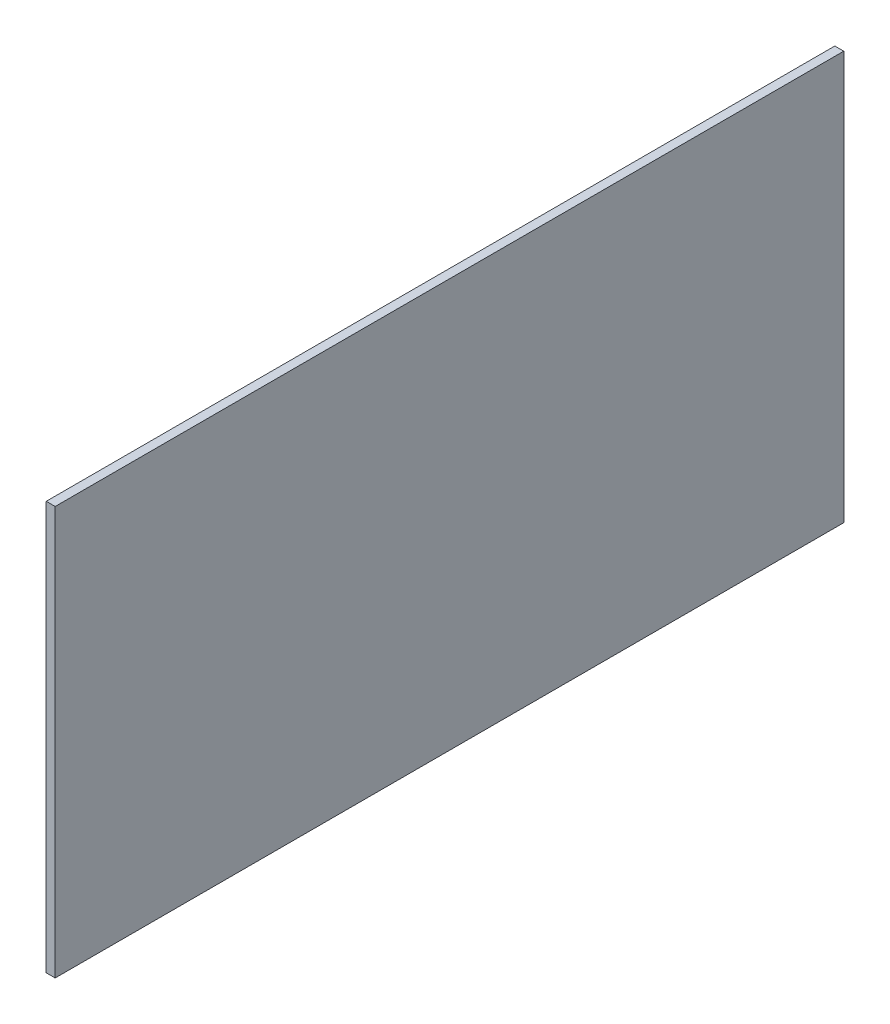
ISO-10303-21;
HEADER;
FILE_DESCRIPTION(('STEP AP214'),'2;1');
FILE_NAME('part.step','',(''),(''),'','','');
FILE_SCHEMA(('AUTOMOTIVE_DESIGN { 1 0 10303 214 1 1 1 1 }'));
ENDSEC;
DATA;
#1=APPLICATION_CONTEXT('core data for automotive mechanical design processes');
#2=APPLICATION_PROTOCOL_DEFINITION('international standard','automotive_design',2000,#1);
#3=PRODUCT_CONTEXT('',#1,'mechanical');
#4=PRODUCT('Part','Part','',(#3));
#5=PRODUCT_RELATED_PRODUCT_CATEGORY('part','',(#4));
#6=PRODUCT_DEFINITION_FORMATION('','',#4);
#7=PRODUCT_DEFINITION_CONTEXT('part definition',#1,'design');
#8=PRODUCT_DEFINITION('design','',#6,#7);
#9=PRODUCT_DEFINITION_SHAPE('','',#8);
#10=(LENGTH_UNIT() NAMED_UNIT(*) SI_UNIT(.MILLI.,.METRE.));
#11=(NAMED_UNIT(*) PLANE_ANGLE_UNIT() SI_UNIT($,.RADIAN.));
#12=(NAMED_UNIT(*) SI_UNIT($,.STERADIAN.) SOLID_ANGLE_UNIT());
#13=UNCERTAINTY_MEASURE_WITH_UNIT(LENGTH_MEASURE(1.E-05),#10,'distance_accuracy_value','');
#14=(GEOMETRIC_REPRESENTATION_CONTEXT(3) GLOBAL_UNCERTAINTY_ASSIGNED_CONTEXT((#13)) GLOBAL_UNIT_ASSIGNED_CONTEXT((#10,
#11,#12)) REPRESENTATION_CONTEXT('',''));
#15=CARTESIAN_POINT('',(0.,0.,0.));
#16=DIRECTION('',(0.,0.,1.));
#17=DIRECTION('',(1.,0.,0.));
#18=AXIS2_PLACEMENT_3D('',#15,#16,#17);
#19=CARTESIAN_POINT('',(3.175,72.5,140.));
#20=DIRECTION('',(0.,0.,-1.));
#21=DIRECTION('',(-1.,0.,0.));
#22=AXIS2_PLACEMENT_3D('',#19,#20,#21);
#23=PLANE('',#22);
#24=DIRECTION('',(0.,-1.,0.));
#25=VECTOR('',#24,1.);
#26=CARTESIAN_POINT('',(0.,72.5,140.));
#27=LINE('',#26,#25);
#28=CARTESIAN_POINT('',(0.,72.5,140.));
#29=VERTEX_POINT('',#28);
#30=CARTESIAN_POINT('',(0.,-72.5,140.));
#31=VERTEX_POINT('',#30);
#32=EDGE_CURVE('E97',#29,#31,#27,.T.);
#33=ORIENTED_EDGE('',*,*,#32,.T.);
#34=DIRECTION('',(-1.,0.,0.));
#35=VECTOR('',#34,1.);
#36=CARTESIAN_POINT('',(3.175,-72.5,140.));
#37=LINE('',#36,#35);
#38=CARTESIAN_POINT('',(3.175,-72.5,140.));
#39=VERTEX_POINT('',#38);
#40=EDGE_CURVE('E11',#39,#31,#37,.T.);
#41=ORIENTED_EDGE('',*,*,#40,.F.);
#42=DIRECTION('',(0.,-1.,0.));
#43=VECTOR('',#42,1.);
#44=CARTESIAN_POINT('',(3.175,72.5,140.));
#45=LINE('',#44,#43);
#46=CARTESIAN_POINT('',(3.175,72.5,140.));
#47=VERTEX_POINT('',#46);
#48=EDGE_CURVE('E85',#47,#39,#45,.T.);
#49=ORIENTED_EDGE('',*,*,#48,.F.);
#50=DIRECTION('',(-1.,0.,0.));
#51=VECTOR('',#50,1.);
#52=CARTESIAN_POINT('',(3.175,72.5,140.));
#53=LINE('',#52,#51);
#54=EDGE_CURVE('E93',#47,#29,#53,.T.);
#55=ORIENTED_EDGE('',*,*,#54,.T.);
#56=EDGE_LOOP('',(#33,#41,#49,#55));
#57=FACE_BOUND('',#56,.T.);
#58=ADVANCED_FACE('F34',(#57),#23,.F.);
#59=CARTESIAN_POINT('',(3.175,-72.5,140.));
#60=DIRECTION('',(0.,1.,0.));
#61=DIRECTION('',(0.,0.,1.));
#62=AXIS2_PLACEMENT_3D('',#59,#60,#61);
#63=PLANE('',#62);
#64=DIRECTION('',(0.,0.,-1.));
#65=VECTOR('',#64,1.);
#66=CARTESIAN_POINT('',(0.,-72.5,140.));
#67=LINE('',#66,#65);
#68=CARTESIAN_POINT('',(0.,-72.5,-140.));
#69=VERTEX_POINT('',#68);
#70=EDGE_CURVE('E89',#31,#69,#67,.T.);
#71=ORIENTED_EDGE('',*,*,#70,.T.);
#72=DIRECTION('',(-1.,0.,0.));
#73=VECTOR('',#72,1.);
#74=CARTESIAN_POINT('',(3.175,-72.5,-140.));
#75=LINE('',#74,#73);
#76=CARTESIAN_POINT('',(3.175,-72.5,-140.));
#77=VERTEX_POINT('',#76);
#78=EDGE_CURVE('E42',#77,#69,#75,.T.);
#79=ORIENTED_EDGE('',*,*,#78,.F.);
#80=DIRECTION('',(0.,0.,-1.));
#81=VECTOR('',#80,1.);
#82=CARTESIAN_POINT('',(3.175,-72.5,140.));
#83=LINE('',#82,#81);
#84=EDGE_CURVE('E80',#39,#77,#83,.T.);
#85=ORIENTED_EDGE('',*,*,#84,.F.);
#86=ORIENTED_EDGE('',*,*,#40,.T.);
#87=EDGE_LOOP('',(#71,#79,#85,#86));
#88=FACE_BOUND('',#87,.T.);
#89=ADVANCED_FACE('F88',(#88),#63,.F.);
#90=CARTESIAN_POINT('',(3.175,72.5,-140.));
#91=DIRECTION('',(0.,0.,1.));
#92=DIRECTION('',(1.,0.,0.));
#93=AXIS2_PLACEMENT_3D('',#90,#91,#92);
#94=PLANE('',#93);
#95=DIRECTION('',(0.,1.,0.));
#96=VECTOR('',#95,1.);
#97=CARTESIAN_POINT('',(0.,72.5,-140.));
#98=LINE('',#97,#96);
#99=CARTESIAN_POINT('',(0.,72.5,-140.));
#100=VERTEX_POINT('',#99);
#101=EDGE_CURVE('E67',#69,#100,#98,.T.);
#102=ORIENTED_EDGE('',*,*,#101,.T.);
#103=DIRECTION('',(-1.,0.,0.));
#104=VECTOR('',#103,1.);
#105=CARTESIAN_POINT('',(3.175,72.5,-140.));
#106=LINE('',#105,#104);
#107=CARTESIAN_POINT('',(3.175,72.5,-140.));
#108=VERTEX_POINT('',#107);
#109=EDGE_CURVE('E90',#108,#100,#106,.T.);
#110=ORIENTED_EDGE('',*,*,#109,.F.);
#111=DIRECTION('',(0.,1.,0.));
#112=VECTOR('',#111,1.);
#113=CARTESIAN_POINT('',(3.175,72.5,-140.));
#114=LINE('',#113,#112);
#115=EDGE_CURVE('E83',#77,#108,#114,.T.);
#116=ORIENTED_EDGE('',*,*,#115,.F.);
#117=ORIENTED_EDGE('',*,*,#78,.T.);
#118=EDGE_LOOP('',(#102,#110,#116,#117));
#119=FACE_BOUND('',#118,.T.);
#120=ADVANCED_FACE('F91',(#119),#94,.F.);
#121=CARTESIAN_POINT('',(3.175,72.5,140.));
#122=DIRECTION('',(0.,-1.,0.));
#123=DIRECTION('',(0.,0.,-1.));
#124=AXIS2_PLACEMENT_3D('',#121,#122,#123);
#125=PLANE('',#124);
#126=DIRECTION('',(0.,0.,1.));
#127=VECTOR('',#126,1.);
#128=CARTESIAN_POINT('',(0.,72.5,140.));
#129=LINE('',#128,#127);
#130=EDGE_CURVE('E73',#100,#29,#129,.T.);
#131=ORIENTED_EDGE('',*,*,#130,.T.);
#132=ORIENTED_EDGE('',*,*,#54,.F.);
#133=DIRECTION('',(0.,0.,1.));
#134=VECTOR('',#133,1.);
#135=CARTESIAN_POINT('',(3.175,72.5,140.));
#136=LINE('',#135,#134);
#137=EDGE_CURVE('E50',#108,#47,#136,.T.);
#138=ORIENTED_EDGE('',*,*,#137,.F.);
#139=ORIENTED_EDGE('',*,*,#109,.T.);
#140=EDGE_LOOP('',(#131,#132,#138,#139));
#141=FACE_BOUND('',#140,.T.);
#142=ADVANCED_FACE('F104',(#141),#125,.F.);
#143=CARTESIAN_POINT('',(3.175,0.,0.));
#144=DIRECTION('',(1.,0.,0.));
#145=DIRECTION('',(0.,0.,-1.));
#146=AXIS2_PLACEMENT_3D('',#143,#144,#145);
#147=PLANE('',#146);
#148=ORIENTED_EDGE('',*,*,#48,.T.);
#149=ORIENTED_EDGE('',*,*,#84,.T.);
#150=ORIENTED_EDGE('',*,*,#115,.T.);
#151=ORIENTED_EDGE('',*,*,#137,.T.);
#152=EDGE_LOOP('',(#148,#149,#150,#151));
#153=FACE_BOUND('',#152,.T.);
#154=ADVANCED_FACE('F81',(#153),#147,.T.);
#155=CARTESIAN_POINT('',(0.,0.,0.));
#156=DIRECTION('',(1.,0.,0.));
#157=DIRECTION('',(0.,0.,-1.));
#158=AXIS2_PLACEMENT_3D('',#155,#156,#157);
#159=PLANE('',#158);
#160=ORIENTED_EDGE('',*,*,#32,.F.);
#161=ORIENTED_EDGE('',*,*,#130,.F.);
#162=ORIENTED_EDGE('',*,*,#101,.F.);
#163=ORIENTED_EDGE('',*,*,#70,.F.);
#164=EDGE_LOOP('',(#160,#161,#162,#163));
#165=FACE_BOUND('',#164,.T.);
#166=ADVANCED_FACE('F107',(#165),#159,.F.);
#167=CLOSED_SHELL('',(#58,#89,#120,#142,#154,#166));
#168=MANIFOLD_SOLID_BREP('B2',#167);
#169=ADVANCED_BREP_SHAPE_REPRESENTATION('',(#18,#168),#14);
#170=SHAPE_DEFINITION_REPRESENTATION(#9,#169);
ENDSEC;
END-ISO-10303-21;
